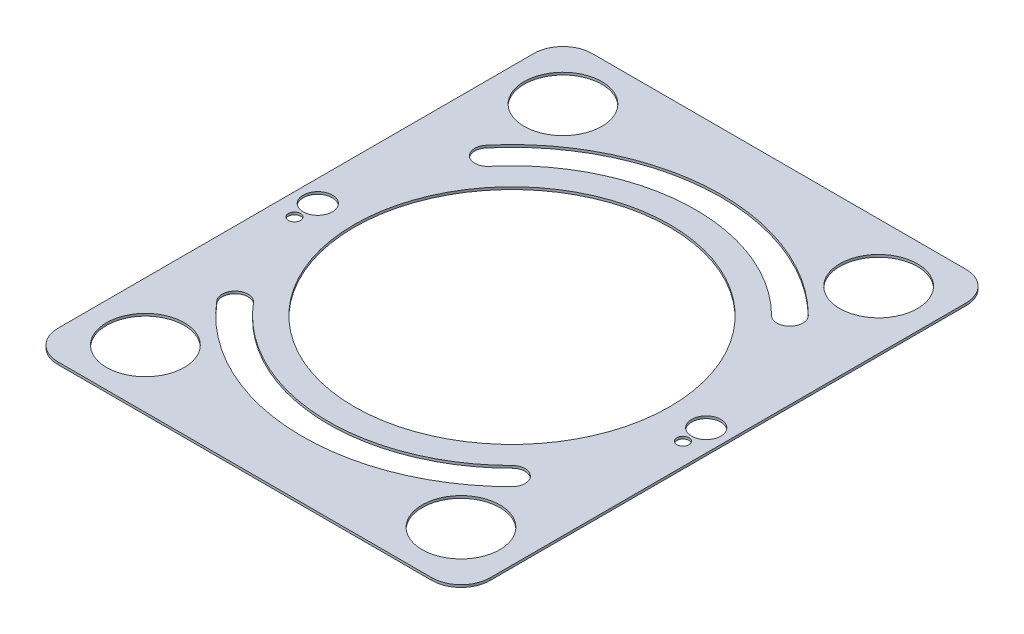
ISO-10303-21;
HEADER;
FILE_DESCRIPTION(('STEP AP214'),'2;1');
FILE_NAME('part.step','',(''),(''),'','','');
FILE_SCHEMA(('AUTOMOTIVE_DESIGN { 1 0 10303 214 1 1 1 1 }'));
ENDSEC;
DATA;
#1=APPLICATION_CONTEXT('core data for automotive mechanical design processes');
#2=APPLICATION_PROTOCOL_DEFINITION('international standard','automotive_design',2000,#1);
#3=PRODUCT_CONTEXT('',#1,'mechanical');
#4=PRODUCT('Part','Part','',(#3));
#5=PRODUCT_RELATED_PRODUCT_CATEGORY('part','',(#4));
#6=PRODUCT_DEFINITION_FORMATION('','',#4);
#7=PRODUCT_DEFINITION_CONTEXT('part definition',#1,'design');
#8=PRODUCT_DEFINITION('design','',#6,#7);
#9=PRODUCT_DEFINITION_SHAPE('','',#8);
#10=(LENGTH_UNIT() NAMED_UNIT(*) SI_UNIT(.MILLI.,.METRE.));
#11=(NAMED_UNIT(*) PLANE_ANGLE_UNIT() SI_UNIT($,.RADIAN.));
#12=(NAMED_UNIT(*) SI_UNIT($,.STERADIAN.) SOLID_ANGLE_UNIT());
#13=UNCERTAINTY_MEASURE_WITH_UNIT(LENGTH_MEASURE(1.E-05),#10,'distance_accuracy_value','');
#14=(GEOMETRIC_REPRESENTATION_CONTEXT(3) GLOBAL_UNCERTAINTY_ASSIGNED_CONTEXT((#13)) GLOBAL_UNIT_ASSIGNED_CONTEXT((#10,
#11,#12)) REPRESENTATION_CONTEXT('',''));
#15=CARTESIAN_POINT('',(0.,0.,0.));
#16=DIRECTION('',(0.,0.,1.));
#17=DIRECTION('',(1.,0.,0.));
#18=AXIS2_PLACEMENT_3D('',#15,#16,#17);
#19=CARTESIAN_POINT('',(-61.1187499999998,0.793750000000093,77.7875));
#20=DIRECTION('',(0.,1.,0.));
#21=DIRECTION('',(0.,0.,1.));
#22=AXIS2_PLACEMENT_3D('',#19,#20,#21);
#23=PLANE('',#22);
#24=CARTESIAN_POINT('',(-63.4999999999999,0.793749999999982,7.6199999999993));
#25=DIRECTION('',(0.,1.,0.));
#26=DIRECTION('',(0.,0.,1.));
#27=AXIS2_PLACEMENT_3D('',#24,#25,#26);
#28=CIRCLE('',#27,1.984375);
#29=CARTESIAN_POINT('',(-63.4999999999999,0.793749999999982,9.6043749999993));
#30=VERTEX_POINT('',#29);
#31=EDGE_CURVE('E401',#30,#30,#28,.T.);
#32=ORIENTED_EDGE('',*,*,#31,.F.);
#33=EDGE_LOOP('',(#32));
#34=FACE_BOUND('',#33,.T.);
#35=CARTESIAN_POINT('',(-63.4999999999999,0.793749999999982,0.));
#36=DIRECTION('',(0.,1.,0.));
#37=DIRECTION('',(0.,0.,1.));
#38=AXIS2_PLACEMENT_3D('',#35,#36,#37);
#39=CIRCLE('',#38,4.7625);
#40=CARTESIAN_POINT('',(-63.4999999999999,0.793749999999982,4.7625));
#41=VERTEX_POINT('',#40);
#42=EDGE_CURVE('E409',#41,#41,#39,.T.);
#43=ORIENTED_EDGE('',*,*,#42,.F.);
#44=EDGE_LOOP('',(#43));
#45=FACE_BOUND('',#44,.T.);
#46=CARTESIAN_POINT('',(0.,0.793749999999982,0.));
#47=DIRECTION('',(0.,-1.,0.));
#48=DIRECTION('',(0.,0.,-1.));
#49=AXIS2_PLACEMENT_3D('',#46,#47,#48);
#50=CIRCLE('',#49,60.0000324);
#51=CARTESIAN_POINT('',(42.426429781453,0.793749999999815,42.4264297814525));
#52=VERTEX_POINT('',#51);
#53=CARTESIAN_POINT('',(-45.9626914069787,0.793749999999871,38.5672774075102));
#54=VERTEX_POINT('',#53);
#55=EDGE_CURVE('E153',#52,#54,#50,.T.);
#56=ORIENTED_EDGE('',*,*,#55,.F.);
#57=CARTESIAN_POINT('',(45.4316352243083,0.793749999998761,45.4316352243054));
#58=DIRECTION('',(0.,1.,0.));
#59=DIRECTION('',(0.,0.,-1.));
#60=AXIS2_PLACEMENT_3D('',#57,#58,#59);
#61=CIRCLE('',#60,4.25000229499999);
#62=CARTESIAN_POINT('',(48.4368406671589,0.793749999999593,48.4368406671583));
#63=VERTEX_POINT('',#62);
#64=EDGE_CURVE('E145',#63,#52,#61,.T.);
#65=ORIENTED_EDGE('',*,*,#64,.F.);
#66=CARTESIAN_POINT('',(0.,0.793749999999982,0.));
#67=DIRECTION('',(0.,1.,0.));
#68=DIRECTION('',(0.,0.,-1.));
#69=AXIS2_PLACEMENT_3D('',#66,#67,#68);
#70=CIRCLE('',#69,68.50003699);
#71=CARTESIAN_POINT('',(-52.474072689634,0.793749999999982,44.0309750402409));
#72=VERTEX_POINT('',#71);
#73=EDGE_CURVE('E168',#72,#63,#70,.T.);
#74=ORIENTED_EDGE('',*,*,#73,.F.);
#75=CARTESIAN_POINT('',(-49.2183820483064,0.793749999999871,41.2991262238755));
#76=DIRECTION('',(0.,1.,0.));
#77=DIRECTION('',(0.,0.,-1.));
#78=AXIS2_PLACEMENT_3D('',#75,#76,#77);
#79=CIRCLE('',#78,4.25000229499998);
#80=EDGE_CURVE('E166',#54,#72,#79,.T.);
#81=ORIENTED_EDGE('',*,*,#80,.F.);
#82=EDGE_LOOP('',(#56,#65,#74,#81));
#83=FACE_BOUND('',#82,.T.);
#84=CARTESIAN_POINT('',(45.4316352243062,0.793749999999482,-45.4316352243054));
#85=DIRECTION('',(0.,1.,0.));
#86=DIRECTION('',(0.,0.,1.));
#87=AXIS2_PLACEMENT_3D('',#84,#85,#86);
#88=CIRCLE('',#87,4.25000229499999);
#89=CARTESIAN_POINT('',(42.4264297814529,0.793749999999871,-42.4264297814525));
#90=VERTEX_POINT('',#89);
#91=CARTESIAN_POINT('',(48.4368406671586,0.79374999999976,-48.4368406671582));
#92=VERTEX_POINT('',#91);
#93=EDGE_CURVE('E186',#90,#92,#88,.T.);
#94=ORIENTED_EDGE('',*,*,#93,.F.);
#95=CARTESIAN_POINT('',(0.,0.793749999999982,0.));
#96=DIRECTION('',(0.,-1.,0.));
#97=DIRECTION('',(0.,0.,1.));
#98=AXIS2_PLACEMENT_3D('',#95,#96,#97);
#99=CIRCLE('',#98,60.0000324);
#100=CARTESIAN_POINT('',(-45.9626914069787,0.793749999999982,-38.5672774075108));
#101=VERTEX_POINT('',#100);
#102=EDGE_CURVE('E184',#101,#90,#99,.T.);
#103=ORIENTED_EDGE('',*,*,#102,.F.);
#104=CARTESIAN_POINT('',(-49.2183820483064,0.793749999999871,-41.2991262238762));
#105=DIRECTION('',(0.,1.,0.));
#106=DIRECTION('',(0.,0.,1.));
#107=AXIS2_PLACEMENT_3D('',#104,#105,#106);
#108=CIRCLE('',#107,4.25000229499998);
#109=CARTESIAN_POINT('',(-52.474072689632,0.793750000000593,-44.0309750402415));
#110=VERTEX_POINT('',#109);
#111=EDGE_CURVE('E192',#110,#101,#108,.T.);
#112=ORIENTED_EDGE('',*,*,#111,.F.);
#113=CARTESIAN_POINT('',(0.,0.793749999999982,0.));
#114=DIRECTION('',(0.,1.,0.));
#115=DIRECTION('',(0.,0.,1.));
#116=AXIS2_PLACEMENT_3D('',#113,#114,#115);
#117=CIRCLE('',#116,68.50003699);
#118=EDGE_CURVE('E189',#92,#110,#117,.T.);
#119=ORIENTED_EDGE('',*,*,#118,.F.);
#120=EDGE_LOOP('',(#94,#103,#112,#119));
#121=FACE_BOUND('',#120,.T.);
#122=CARTESIAN_POINT('',(51.5937500000005,0.793749999999982,68.2625));
#123=DIRECTION('',(0.,1.,0.));
#124=DIRECTION('',(0.,0.,1.));
#125=AXIS2_PLACEMENT_3D('',#122,#123,#124);
#126=CIRCLE('',#125,12.7);
#127=CARTESIAN_POINT('',(51.5937500000005,0.793749999999982,80.9625));
#128=VERTEX_POINT('',#127);
#129=EDGE_CURVE('E215',#128,#128,#126,.T.);
#130=ORIENTED_EDGE('',*,*,#129,.F.);
#131=EDGE_LOOP('',(#130));
#132=FACE_BOUND('',#131,.T.);
#133=CARTESIAN_POINT('',(51.5937500000002,0.793749999999427,-68.2625000000001));
#134=DIRECTION('',(0.,1.,0.));
#135=DIRECTION('',(0.,0.,1.));
#136=AXIS2_PLACEMENT_3D('',#133,#134,#135);
#137=CIRCLE('',#136,12.7);
#138=CARTESIAN_POINT('',(51.5937500000002,0.793749999999427,-55.5625000000001));
#139=VERTEX_POINT('',#138);
#140=EDGE_CURVE('E227',#139,#139,#137,.T.);
#141=ORIENTED_EDGE('',*,*,#140,.F.);
#142=EDGE_LOOP('',(#141));
#143=FACE_BOUND('',#142,.T.);
#144=CARTESIAN_POINT('',(-61.1187499999998,0.793750000000093,77.7875));
#145=DIRECTION('',(0.,1.,0.));
#146=DIRECTION('',(0.,0.,1.));
#147=AXIS2_PLACEMENT_3D('',#144,#145,#146);
#148=CIRCLE('',#147,9.525);
#149=CARTESIAN_POINT('',(-70.6437499999999,0.793750000000037,77.7875));
#150=VERTEX_POINT('',#149);
#151=CARTESIAN_POINT('',(-61.1187499999982,0.793750000000759,87.3125));
#152=VERTEX_POINT('',#151);
#153=EDGE_CURVE('E239',#150,#152,#148,.T.);
#154=ORIENTED_EDGE('',*,*,#153,.T.);
#155=DIRECTION('',(1.,0.,0.));
#156=VECTOR('',#155,1.);
#157=CARTESIAN_POINT('',(-61.1187499999982,0.793750000000759,87.3125));
#158=LINE('',#157,#156);
#159=CARTESIAN_POINT('',(61.1187500000006,0.793749999999427,87.3125));
#160=VERTEX_POINT('',#159);
#161=EDGE_CURVE('E242',#152,#160,#158,.T.);
#162=ORIENTED_EDGE('',*,*,#161,.T.);
#163=CARTESIAN_POINT('',(61.1187500000006,0.793749999999427,77.7875));
#164=DIRECTION('',(0.,1.,0.));
#165=DIRECTION('',(0.,0.,1.));
#166=AXIS2_PLACEMENT_3D('',#163,#164,#165);
#167=CIRCLE('',#166,9.525);
#168=CARTESIAN_POINT('',(70.6437500000024,0.793749999998872,77.7875));
#169=VERTEX_POINT('',#168);
#170=EDGE_CURVE('E245',#160,#169,#167,.T.);
#171=ORIENTED_EDGE('',*,*,#170,.T.);
#172=DIRECTION('',(0.,0.,-1.));
#173=VECTOR('',#172,1.);
#174=CARTESIAN_POINT('',(70.6437500000001,0.793749999999815,-77.7875));
#175=LINE('',#174,#173);
#176=CARTESIAN_POINT('',(70.6437500000001,0.793749999999815,-77.7875));
#177=VERTEX_POINT('',#176);
#178=EDGE_CURVE('E247',#169,#177,#175,.T.);
#179=ORIENTED_EDGE('',*,*,#178,.T.);
#180=CARTESIAN_POINT('',(61.1187500000001,0.793749999999649,-77.7875000000001));
#181=DIRECTION('',(0.,1.,0.));
#182=DIRECTION('',(0.,0.,-1.));
#183=AXIS2_PLACEMENT_3D('',#180,#181,#182);
#184=CIRCLE('',#183,9.525);
#185=CARTESIAN_POINT('',(61.1187500000001,0.793749999999649,-87.3125000000001));
#186=VERTEX_POINT('',#185);
#187=EDGE_CURVE('E249',#177,#186,#184,.T.);
#188=ORIENTED_EDGE('',*,*,#187,.T.);
#189=DIRECTION('',(-1.,0.,0.));
#190=VECTOR('',#189,1.);
#191=CARTESIAN_POINT('',(-61.1187499999996,0.793749999999427,-87.3125000000001));
#192=LINE('',#191,#190);
#193=CARTESIAN_POINT('',(-61.1187499999996,0.793749999999427,-87.3125000000001));
#194=VERTEX_POINT('',#193);
#195=EDGE_CURVE('E251',#186,#194,#192,.T.);
#196=ORIENTED_EDGE('',*,*,#195,.T.);
#197=CARTESIAN_POINT('',(-61.1187499999999,0.793749999999871,-77.7875000000001));
#198=DIRECTION('',(0.,1.,0.));
#199=DIRECTION('',(0.,0.,1.));
#200=AXIS2_PLACEMENT_3D('',#197,#198,#199);
#201=CIRCLE('',#200,9.525);
#202=CARTESIAN_POINT('',(-70.6437499999999,0.793749999999205,-77.7875));
#203=VERTEX_POINT('',#202);
#204=EDGE_CURVE('E253',#194,#203,#201,.T.);
#205=ORIENTED_EDGE('',*,*,#204,.T.);
#206=DIRECTION('',(0.,0.,1.));
#207=VECTOR('',#206,1.);
#208=CARTESIAN_POINT('',(-70.6437499999999,0.793749999999205,-77.7875));
#209=LINE('',#208,#207);
#210=EDGE_CURVE('E255',#203,#150,#209,.T.);
#211=ORIENTED_EDGE('',*,*,#210,.T.);
#212=EDGE_LOOP('',(#154,#162,#171,#179,#188,#196,#205,#211));
#213=FACE_BOUND('',#212,.T.);
#214=CARTESIAN_POINT('',(-51.5937499999996,0.793749999999982,-68.2625000000001));
#215=DIRECTION('',(0.,1.,0.));
#216=DIRECTION('',(0.,0.,1.));
#217=AXIS2_PLACEMENT_3D('',#214,#215,#216);
#218=CIRCLE('',#217,12.7);
#219=CARTESIAN_POINT('',(-51.5937499999996,0.793749999999982,-55.5625000000001));
#220=VERTEX_POINT('',#219);
#221=EDGE_CURVE('E233',#220,#220,#218,.T.);
#222=ORIENTED_EDGE('',*,*,#221,.F.);
#223=EDGE_LOOP('',(#222));
#224=FACE_BOUND('',#223,.T.);
#225=CARTESIAN_POINT('',(-51.59375,0.793749999999982,68.2625));
#226=DIRECTION('',(0.,1.,0.));
#227=DIRECTION('',(0.,0.,1.));
#228=AXIS2_PLACEMENT_3D('',#225,#226,#227);
#229=CIRCLE('',#228,12.7);
#230=CARTESIAN_POINT('',(-51.59375,0.793749999999982,80.9625));
#231=VERTEX_POINT('',#230);
#232=EDGE_CURVE('E221',#231,#231,#229,.T.);
#233=ORIENTED_EDGE('',*,*,#232,.F.);
#234=EDGE_LOOP('',(#233));
#235=FACE_BOUND('',#234,.T.);
#236=CARTESIAN_POINT('',(0.,0.793749999999982,0.));
#237=DIRECTION('',(0.,1.,0.));
#238=DIRECTION('',(0.,0.,1.));
#239=AXIS2_PLACEMENT_3D('',#236,#237,#238);
#240=CIRCLE('',#239,51.59375);
#241=CARTESIAN_POINT('',(0.,0.793749999999982,51.59375));
#242=VERTEX_POINT('',#241);
#243=EDGE_CURVE('E174',#242,#242,#240,.T.);
#244=ORIENTED_EDGE('',*,*,#243,.F.);
#245=EDGE_LOOP('',(#244));
#246=FACE_BOUND('',#245,.T.);
#247=CARTESIAN_POINT('',(63.5000000000012,0.793749999999427,0.));
#248=DIRECTION('',(0.,1.,0.));
#249=DIRECTION('',(0.,0.,1.));
#250=AXIS2_PLACEMENT_3D('',#247,#248,#249);
#251=CIRCLE('',#250,4.7625);
#252=CARTESIAN_POINT('',(63.5000000000012,0.793749999999427,4.7625));
#253=VERTEX_POINT('',#252);
#254=EDGE_CURVE('E405',#253,#253,#251,.T.);
#255=ORIENTED_EDGE('',*,*,#254,.F.);
#256=EDGE_LOOP('',(#255));
#257=FACE_BOUND('',#256,.T.);
#258=CARTESIAN_POINT('',(63.5000000000012,0.793749999999427,7.6199999999993));
#259=DIRECTION('',(0.,1.,0.));
#260=DIRECTION('',(0.,0.,1.));
#261=AXIS2_PLACEMENT_3D('',#258,#259,#260);
#262=CIRCLE('',#261,1.984375);
#263=CARTESIAN_POINT('',(63.5000000000012,0.793749999999427,9.6043749999993));
#264=VERTEX_POINT('',#263);
#265=EDGE_CURVE('E396',#264,#264,#262,.T.);
#266=ORIENTED_EDGE('',*,*,#265,.F.);
#267=EDGE_LOOP('',(#266));
#268=FACE_BOUND('',#267,.T.);
#269=ADVANCED_FACE('F32',(#34,#45,#83,#121,#132,#143,#213,#224,#235,#246,#257,#268),#23,.T.);
#270=CARTESIAN_POINT('',(-61.11875,0.,77.7875));
#271=DIRECTION('',(0.,1.,0.));
#272=DIRECTION('',(0.,0.,1.));
#273=AXIS2_PLACEMENT_3D('',#270,#271,#272);
#274=PLANE('',#273);
#275=CARTESIAN_POINT('',(0.,0.,0.));
#276=DIRECTION('',(0.,-1.,0.));
#277=DIRECTION('',(0.,0.,1.));
#278=AXIS2_PLACEMENT_3D('',#275,#276,#277);
#279=CIRCLE('',#278,60.0000324);
#280=CARTESIAN_POINT('',(-45.9626914069785,-2.77555756156289E-13,-38.5672774075108));
#281=VERTEX_POINT('',#280);
#282=CARTESIAN_POINT('',(42.4264297814531,-2.22044604925031E-13,-42.4264297814525));
#283=VERTEX_POINT('',#282);
#284=EDGE_CURVE('E161',#281,#283,#279,.T.);
#285=ORIENTED_EDGE('',*,*,#284,.T.);
#286=CARTESIAN_POINT('',(45.4316352243065,-1.33226762955019E-12,-45.4316352243054));
#287=DIRECTION('',(0.,1.,0.));
#288=DIRECTION('',(0.,0.,1.));
#289=AXIS2_PLACEMENT_3D('',#286,#287,#288);
#290=CIRCLE('',#289,4.25000229499999);
#291=CARTESIAN_POINT('',(48.436840667159,-4.44089209850063E-13,-48.4368406671582));
#292=VERTEX_POINT('',#291);
#293=EDGE_CURVE('E197',#283,#292,#290,.T.);
#294=ORIENTED_EDGE('',*,*,#293,.T.);
#295=CARTESIAN_POINT('',(0.,0.,0.));
#296=DIRECTION('',(0.,1.,0.));
#297=DIRECTION('',(0.,0.,1.));
#298=AXIS2_PLACEMENT_3D('',#295,#296,#297);
#299=CIRCLE('',#298,68.50003699);
#300=CARTESIAN_POINT('',(-52.4740726896339,-2.77555756156289E-13,-44.0309750402415));
#301=VERTEX_POINT('',#300);
#302=EDGE_CURVE('E200',#292,#301,#299,.T.);
#303=ORIENTED_EDGE('',*,*,#302,.T.);
#304=CARTESIAN_POINT('',(-49.2183820483045,-1.66533453693773E-13,-41.2991262238762));
#305=DIRECTION('',(0.,1.,0.));
#306=DIRECTION('',(0.,0.,1.));
#307=AXIS2_PLACEMENT_3D('',#304,#305,#306);
#308=CIRCLE('',#307,4.25000229499998);
#309=EDGE_CURVE('E187',#301,#281,#308,.T.);
#310=ORIENTED_EDGE('',*,*,#309,.T.);
#311=EDGE_LOOP('',(#285,#294,#303,#310));
#312=FACE_BOUND('',#311,.T.);
#313=CARTESIAN_POINT('',(-61.11875,0.,77.7875));
#314=DIRECTION('',(0.,1.,0.));
#315=DIRECTION('',(0.,0.,1.));
#316=AXIS2_PLACEMENT_3D('',#313,#314,#315);
#317=CIRCLE('',#316,9.525);
#318=CARTESIAN_POINT('',(-70.64375,0.,77.7875));
#319=VERTEX_POINT('',#318);
#320=CARTESIAN_POINT('',(-61.1187499999998,1.11022302462516E-13,87.3125));
#321=VERTEX_POINT('',#320);
#322=EDGE_CURVE('E236',#319,#321,#317,.T.);
#323=ORIENTED_EDGE('',*,*,#322,.F.);
#324=DIRECTION('',(0.,0.,1.));
#325=VECTOR('',#324,1.);
#326=CARTESIAN_POINT('',(-70.6437499999999,-7.21644966006352E-13,-77.7875));
#327=LINE('',#326,#325);
#328=CARTESIAN_POINT('',(-70.6437499999999,-7.21644966006352E-13,-77.7875));
#329=VERTEX_POINT('',#328);
#330=EDGE_CURVE('E243',#329,#319,#327,.T.);
#331=ORIENTED_EDGE('',*,*,#330,.F.);
#332=CARTESIAN_POINT('',(-61.1187499999996,-6.66133814775094E-13,-77.7875000000001));
#333=DIRECTION('',(0.,1.,0.));
#334=DIRECTION('',(0.,0.,1.));
#335=AXIS2_PLACEMENT_3D('',#332,#333,#334);
#336=CIRCLE('',#335,9.525);
#337=CARTESIAN_POINT('',(-61.1187499999998,-1.66533453693773E-13,-87.3125000000001));
#338=VERTEX_POINT('',#337);
#339=EDGE_CURVE('E270',#338,#329,#336,.T.);
#340=ORIENTED_EDGE('',*,*,#339,.F.);
#341=DIRECTION('',(-1.,0.,0.));
#342=VECTOR('',#341,1.);
#343=CARTESIAN_POINT('',(-61.1187499999998,-1.66533453693773E-13,-87.3125000000001));
#344=LINE('',#343,#342);
#345=CARTESIAN_POINT('',(61.11875,-3.33066907387547E-13,-87.3125000000001));
#346=VERTEX_POINT('',#345);
#347=EDGE_CURVE('E268',#346,#338,#344,.T.);
#348=ORIENTED_EDGE('',*,*,#347,.F.);
#349=CARTESIAN_POINT('',(61.1187500000022,-2.44249065417534E-12,-77.7875000000001));
#350=DIRECTION('',(0.,1.,0.));
#351=DIRECTION('',(0.,0.,-1.));
#352=AXIS2_PLACEMENT_3D('',#349,#350,#351);
#353=CIRCLE('',#352,9.525);
#354=CARTESIAN_POINT('',(70.6437500000005,-3.33066907387547E-13,-77.7875));
#355=VERTEX_POINT('',#354);
#356=EDGE_CURVE('E266',#355,#346,#353,.T.);
#357=ORIENTED_EDGE('',*,*,#356,.F.);
#358=DIRECTION('',(0.,0.,-1.));
#359=VECTOR('',#358,1.);
#360=CARTESIAN_POINT('',(70.6437500000005,-3.33066907387547E-13,-77.7875));
#361=LINE('',#360,#359);
#362=CARTESIAN_POINT('',(70.6437500000033,-1.49880108324396E-12,77.7875));
#363=VERTEX_POINT('',#362);
#364=EDGE_CURVE('E264',#363,#355,#361,.T.);
#365=ORIENTED_EDGE('',*,*,#364,.F.);
#366=CARTESIAN_POINT('',(61.1187500000028,-1.49880108324396E-12,77.7875));
#367=DIRECTION('',(0.,1.,0.));
#368=DIRECTION('',(0.,0.,1.));
#369=AXIS2_PLACEMENT_3D('',#366,#367,#368);
#370=CIRCLE('',#369,9.525);
#371=CARTESIAN_POINT('',(61.1187500000028,-1.49880108324396E-12,87.3125));
#372=VERTEX_POINT('',#371);
#373=EDGE_CURVE('E262',#372,#363,#370,.T.);
#374=ORIENTED_EDGE('',*,*,#373,.F.);
#375=DIRECTION('',(1.,0.,0.));
#376=VECTOR('',#375,1.);
#377=CARTESIAN_POINT('',(-61.1187499999998,1.11022302462516E-13,87.3125));
#378=LINE('',#377,#376);
#379=EDGE_CURVE('E260',#321,#372,#378,.T.);
#380=ORIENTED_EDGE('',*,*,#379,.F.);
#381=EDGE_LOOP('',(#323,#331,#340,#348,#357,#365,#374,#380));
#382=FACE_BOUND('',#381,.T.);
#383=CARTESIAN_POINT('',(-51.5937499999992,-8.32667268468867E-13,-68.2625000000001));
#384=DIRECTION('',(0.,1.,0.));
#385=DIRECTION('',(0.,0.,1.));
#386=AXIS2_PLACEMENT_3D('',#383,#384,#385);
#387=CIRCLE('',#386,12.7);
#388=CARTESIAN_POINT('',(-51.5937499999992,-8.32667268468867E-13,-55.5625000000001));
#389=VERTEX_POINT('',#388);
#390=EDGE_CURVE('E230',#389,#389,#387,.T.);
#391=ORIENTED_EDGE('',*,*,#390,.T.);
#392=EDGE_LOOP('',(#391));
#393=FACE_BOUND('',#392,.T.);
#394=CARTESIAN_POINT('',(51.5937500000025,-1.55431223447522E-12,-68.2625000000001));
#395=DIRECTION('',(0.,1.,0.));
#396=DIRECTION('',(0.,0.,1.));
#397=AXIS2_PLACEMENT_3D('',#394,#395,#396);
#398=CIRCLE('',#397,12.7);
#399=CARTESIAN_POINT('',(51.5937500000025,-1.55431223447522E-12,-55.5625000000001));
#400=VERTEX_POINT('',#399);
#401=EDGE_CURVE('E224',#400,#400,#398,.T.);
#402=ORIENTED_EDGE('',*,*,#401,.T.);
#403=EDGE_LOOP('',(#402));
#404=FACE_BOUND('',#403,.T.);
#405=CARTESIAN_POINT('',(-51.5937499999999,-1.66533453693773E-13,68.2625));
#406=DIRECTION('',(0.,1.,0.));
#407=DIRECTION('',(0.,0.,1.));
#408=AXIS2_PLACEMENT_3D('',#405,#406,#407);
#409=CIRCLE('',#408,12.7);
#410=CARTESIAN_POINT('',(-51.5937499999999,-1.66533453693773E-13,80.9625));
#411=VERTEX_POINT('',#410);
#412=EDGE_CURVE('E218',#411,#411,#409,.T.);
#413=ORIENTED_EDGE('',*,*,#412,.T.);
#414=EDGE_LOOP('',(#413));
#415=FACE_BOUND('',#414,.T.);
#416=CARTESIAN_POINT('',(51.5937500000004,-1.66533453693773E-13,68.2625));
#417=DIRECTION('',(0.,1.,0.));
#418=DIRECTION('',(0.,0.,1.));
#419=AXIS2_PLACEMENT_3D('',#416,#417,#418);
#420=CIRCLE('',#419,12.7);
#421=CARTESIAN_POINT('',(51.5937500000004,-1.66533453693773E-13,80.9625));
#422=VERTEX_POINT('',#421);
#423=EDGE_CURVE('E214',#422,#422,#420,.T.);
#424=ORIENTED_EDGE('',*,*,#423,.T.);
#425=EDGE_LOOP('',(#424));
#426=FACE_BOUND('',#425,.T.);
#427=CARTESIAN_POINT('',(45.4316352243082,-1.27675647831893E-12,45.4316352243054));
#428=DIRECTION('',(0.,1.,0.));
#429=DIRECTION('',(0.,0.,-1.));
#430=AXIS2_PLACEMENT_3D('',#427,#428,#429);
#431=CIRCLE('',#430,4.25000229499999);
#432=CARTESIAN_POINT('',(48.4368406671609,-1.22124532708767E-12,48.4368406671583));
#433=VERTEX_POINT('',#432);
#434=CARTESIAN_POINT('',(42.4264297814531,-2.22044604925031E-13,42.4264297814525));
#435=VERTEX_POINT('',#434);
#436=EDGE_CURVE('E55',#433,#435,#431,.T.);
#437=ORIENTED_EDGE('',*,*,#436,.T.);
#438=CARTESIAN_POINT('',(0.,0.,0.));
#439=DIRECTION('',(0.,-1.,0.));
#440=DIRECTION('',(0.,0.,-1.));
#441=AXIS2_PLACEMENT_3D('',#438,#439,#440);
#442=CIRCLE('',#441,60.0000324);
#443=CARTESIAN_POINT('',(-45.9626914069786,-2.77555756156289E-13,38.5672774075102));
#444=VERTEX_POINT('',#443);
#445=EDGE_CURVE('E160',#435,#444,#442,.T.);
#446=ORIENTED_EDGE('',*,*,#445,.T.);
#447=CARTESIAN_POINT('',(-49.2183820483062,1.66533453693773E-13,41.2991262238755));
#448=DIRECTION('',(0.,1.,0.));
#449=DIRECTION('',(0.,0.,-1.));
#450=AXIS2_PLACEMENT_3D('',#447,#448,#449);
#451=CIRCLE('',#450,4.25000229499998);
#452=CARTESIAN_POINT('',(-52.474072689634,0.,44.0309750402408));
#453=VERTEX_POINT('',#452);
#454=EDGE_CURVE('E176',#444,#453,#451,.T.);
#455=ORIENTED_EDGE('',*,*,#454,.T.);
#456=CARTESIAN_POINT('',(0.,0.,0.));
#457=DIRECTION('',(0.,1.,0.));
#458=DIRECTION('',(0.,0.,-1.));
#459=AXIS2_PLACEMENT_3D('',#456,#457,#458);
#460=CIRCLE('',#459,68.50003699);
#461=EDGE_CURVE('E154',#453,#433,#460,.T.);
#462=ORIENTED_EDGE('',*,*,#461,.T.);
#463=EDGE_LOOP('',(#437,#446,#455,#462));
#464=FACE_BOUND('',#463,.T.);
#465=CARTESIAN_POINT('',(0.,0.,0.));
#466=DIRECTION('',(0.,1.,0.));
#467=DIRECTION('',(0.,0.,1.));
#468=AXIS2_PLACEMENT_3D('',#465,#466,#467);
#469=CIRCLE('',#468,51.59375);
#470=CARTESIAN_POINT('',(0.,0.,51.59375));
#471=VERTEX_POINT('',#470);
#472=EDGE_CURVE('E379',#471,#471,#469,.T.);
#473=ORIENTED_EDGE('',*,*,#472,.T.);
#474=EDGE_LOOP('',(#473));
#475=FACE_BOUND('',#474,.T.);
#476=CARTESIAN_POINT('',(-63.5,0.,0.));
#477=DIRECTION('',(0.,1.,0.));
#478=DIRECTION('',(0.,0.,1.));
#479=AXIS2_PLACEMENT_3D('',#476,#477,#478);
#480=CIRCLE('',#479,4.7625);
#481=CARTESIAN_POINT('',(-63.5,0.,4.7625));
#482=VERTEX_POINT('',#481);
#483=EDGE_CURVE('E383',#482,#482,#480,.T.);
#484=ORIENTED_EDGE('',*,*,#483,.T.);
#485=EDGE_LOOP('',(#484));
#486=FACE_BOUND('',#485,.T.);
#487=CARTESIAN_POINT('',(63.5000000000002,-1.66533453693773E-13,0.));
#488=DIRECTION('',(0.,1.,0.));
#489=DIRECTION('',(0.,0.,1.));
#490=AXIS2_PLACEMENT_3D('',#487,#488,#489);
#491=CIRCLE('',#490,4.7625);
#492=CARTESIAN_POINT('',(63.5000000000002,-1.66533453693773E-13,4.7625));
#493=VERTEX_POINT('',#492);
#494=EDGE_CURVE('E387',#493,#493,#491,.T.);
#495=ORIENTED_EDGE('',*,*,#494,.T.);
#496=EDGE_LOOP('',(#495));
#497=FACE_BOUND('',#496,.T.);
#498=CARTESIAN_POINT('',(-63.5,0.,7.6199999999993));
#499=DIRECTION('',(0.,1.,0.));
#500=DIRECTION('',(0.,0.,1.));
#501=AXIS2_PLACEMENT_3D('',#498,#499,#500);
#502=CIRCLE('',#501,1.984375);
#503=CARTESIAN_POINT('',(-63.5,0.,9.6043749999993));
#504=VERTEX_POINT('',#503);
#505=EDGE_CURVE('E391',#504,#504,#502,.T.);
#506=ORIENTED_EDGE('',*,*,#505,.T.);
#507=EDGE_LOOP('',(#506));
#508=FACE_BOUND('',#507,.T.);
#509=CARTESIAN_POINT('',(63.5000000000002,-1.66533453693773E-13,7.6199999999993));
#510=DIRECTION('',(0.,1.,0.));
#511=DIRECTION('',(0.,0.,1.));
#512=AXIS2_PLACEMENT_3D('',#509,#510,#511);
#513=CIRCLE('',#512,1.984375);
#514=CARTESIAN_POINT('',(63.5000000000002,-1.66533453693773E-13,9.6043749999993));
#515=VERTEX_POINT('',#514);
#516=EDGE_CURVE('E394',#515,#515,#513,.T.);
#517=ORIENTED_EDGE('',*,*,#516,.T.);
#518=EDGE_LOOP('',(#517));
#519=FACE_BOUND('',#518,.T.);
#520=ADVANCED_FACE('F300',(#312,#382,#393,#404,#415,#426,#464,#475,#486,#497,#508,#519),#274,.F.);
#521=CARTESIAN_POINT('',(-61.1187499999998,0.793750000000093,77.7875));
#522=DIRECTION('',(0.,-1.,0.));
#523=DIRECTION('',(0.,0.,-1.));
#524=AXIS2_PLACEMENT_3D('',#521,#522,#523);
#525=CYLINDRICAL_SURFACE('',#524,9.525);
#526=ORIENTED_EDGE('',*,*,#322,.T.);
#527=DIRECTION('',(0.,-1.,0.));
#528=VECTOR('',#527,1.);
#529=CARTESIAN_POINT('',(-61.1187499999982,0.793750000000759,87.3125));
#530=LINE('',#529,#528);
#531=EDGE_CURVE('E11',#152,#321,#530,.T.);
#532=ORIENTED_EDGE('',*,*,#531,.F.);
#533=ORIENTED_EDGE('',*,*,#153,.F.);
#534=DIRECTION('',(0.,-1.,0.));
#535=VECTOR('',#534,1.);
#536=CARTESIAN_POINT('',(-70.6437499999999,0.793750000000037,77.7875));
#537=LINE('',#536,#535);
#538=EDGE_CURVE('E257',#150,#319,#537,.T.);
#539=ORIENTED_EDGE('',*,*,#538,.T.);
#540=EDGE_LOOP('',(#526,#532,#533,#539));
#541=FACE_BOUND('',#540,.T.);
#542=ADVANCED_FACE('F34',(#541),#525,.T.);
#543=CARTESIAN_POINT('',(-61.1187499999982,0.793750000000759,87.3125));
#544=DIRECTION('',(0.,0.,-1.));
#545=DIRECTION('',(-1.,0.,0.));
#546=AXIS2_PLACEMENT_3D('',#543,#544,#545);
#547=PLANE('',#546);
#548=ORIENTED_EDGE('',*,*,#379,.T.);
#549=DIRECTION('',(0.,-1.,0.));
#550=VECTOR('',#549,1.);
#551=CARTESIAN_POINT('',(61.1187500000006,0.793749999999427,87.3125));
#552=LINE('',#551,#550);
#553=EDGE_CURVE('E40',#160,#372,#552,.T.);
#554=ORIENTED_EDGE('',*,*,#553,.F.);
#555=ORIENTED_EDGE('',*,*,#161,.F.);
#556=ORIENTED_EDGE('',*,*,#531,.T.);
#557=EDGE_LOOP('',(#548,#554,#555,#556));
#558=FACE_BOUND('',#557,.T.);
#559=ADVANCED_FACE('F318',(#558),#547,.F.);
#560=CARTESIAN_POINT('',(61.1187500000006,0.793749999999427,77.7875));
#561=DIRECTION('',(0.,-1.,0.));
#562=DIRECTION('',(0.,0.,-1.));
#563=AXIS2_PLACEMENT_3D('',#560,#561,#562);
#564=CYLINDRICAL_SURFACE('',#563,9.525);
#565=ORIENTED_EDGE('',*,*,#373,.T.);
#566=DIRECTION('',(0.,-1.,0.));
#567=VECTOR('',#566,1.);
#568=CARTESIAN_POINT('',(70.6437500000024,0.793749999998872,77.7875));
#569=LINE('',#568,#567);
#570=EDGE_CURVE('E287',#169,#363,#569,.T.);
#571=ORIENTED_EDGE('',*,*,#570,.F.);
#572=ORIENTED_EDGE('',*,*,#170,.F.);
#573=ORIENTED_EDGE('',*,*,#553,.T.);
#574=EDGE_LOOP('',(#565,#571,#572,#573));
#575=FACE_BOUND('',#574,.T.);
#576=ADVANCED_FACE('F294',(#575),#564,.T.);
#577=CARTESIAN_POINT('',(70.6437500000001,0.793749999999815,-77.7875));
#578=DIRECTION('',(-1.,0.,0.));
#579=DIRECTION('',(0.,0.,1.));
#580=AXIS2_PLACEMENT_3D('',#577,#578,#579);
#581=PLANE('',#580);
#582=ORIENTED_EDGE('',*,*,#364,.T.);
#583=DIRECTION('',(0.,-1.,0.));
#584=VECTOR('',#583,1.);
#585=CARTESIAN_POINT('',(70.6437500000001,0.793749999999815,-77.7875));
#586=LINE('',#585,#584);
#587=EDGE_CURVE('E284',#177,#355,#586,.T.);
#588=ORIENTED_EDGE('',*,*,#587,.F.);
#589=ORIENTED_EDGE('',*,*,#178,.F.);
#590=ORIENTED_EDGE('',*,*,#570,.T.);
#591=EDGE_LOOP('',(#582,#588,#589,#590));
#592=FACE_BOUND('',#591,.T.);
#593=ADVANCED_FACE('F306',(#592),#581,.F.);
#594=CARTESIAN_POINT('',(61.1187500000001,0.793749999999649,-77.7875000000001));
#595=DIRECTION('',(0.,-1.,0.));
#596=DIRECTION('',(0.,0.,-1.));
#597=AXIS2_PLACEMENT_3D('',#594,#595,#596);
#598=CYLINDRICAL_SURFACE('',#597,9.525);
#599=ORIENTED_EDGE('',*,*,#356,.T.);
#600=DIRECTION('',(0.,-1.,0.));
#601=VECTOR('',#600,1.);
#602=CARTESIAN_POINT('',(61.1187500000001,0.793749999999649,-87.3125000000001));
#603=LINE('',#602,#601);
#604=EDGE_CURVE('E281',#186,#346,#603,.T.);
#605=ORIENTED_EDGE('',*,*,#604,.F.);
#606=ORIENTED_EDGE('',*,*,#187,.F.);
#607=ORIENTED_EDGE('',*,*,#587,.T.);
#608=EDGE_LOOP('',(#599,#605,#606,#607));
#609=FACE_BOUND('',#608,.T.);
#610=ADVANCED_FACE('F310',(#609),#598,.T.);
#611=CARTESIAN_POINT('',(-61.1187499999996,0.793749999999427,-87.3125000000001));
#612=DIRECTION('',(0.,0.,1.));
#613=DIRECTION('',(1.,0.,0.));
#614=AXIS2_PLACEMENT_3D('',#611,#612,#613);
#615=PLANE('',#614);
#616=ORIENTED_EDGE('',*,*,#347,.T.);
#617=DIRECTION('',(0.,-1.,0.));
#618=VECTOR('',#617,1.);
#619=CARTESIAN_POINT('',(-61.1187499999996,0.793749999999427,-87.3125000000001));
#620=LINE('',#619,#618);
#621=EDGE_CURVE('E278',#194,#338,#620,.T.);
#622=ORIENTED_EDGE('',*,*,#621,.F.);
#623=ORIENTED_EDGE('',*,*,#195,.F.);
#624=ORIENTED_EDGE('',*,*,#604,.T.);
#625=EDGE_LOOP('',(#616,#622,#623,#624));
#626=FACE_BOUND('',#625,.T.);
#627=ADVANCED_FACE('F331',(#626),#615,.F.);
#628=CARTESIAN_POINT('',(-61.1187499999999,0.793749999999871,-77.7875000000001));
#629=DIRECTION('',(0.,-1.,0.));
#630=DIRECTION('',(0.,0.,-1.));
#631=AXIS2_PLACEMENT_3D('',#628,#629,#630);
#632=CYLINDRICAL_SURFACE('',#631,9.525);
#633=ORIENTED_EDGE('',*,*,#339,.T.);
#634=DIRECTION('',(0.,-1.,0.));
#635=VECTOR('',#634,1.);
#636=CARTESIAN_POINT('',(-70.6437499999999,0.793749999999205,-77.7875));
#637=LINE('',#636,#635);
#638=EDGE_CURVE('E275',#203,#329,#637,.T.);
#639=ORIENTED_EDGE('',*,*,#638,.F.);
#640=ORIENTED_EDGE('',*,*,#204,.F.);
#641=ORIENTED_EDGE('',*,*,#621,.T.);
#642=EDGE_LOOP('',(#633,#639,#640,#641));
#643=FACE_BOUND('',#642,.T.);
#644=ADVANCED_FACE('F329',(#643),#632,.T.);
#645=CARTESIAN_POINT('',(-70.6437499999999,0.793749999999205,-77.7875));
#646=DIRECTION('',(1.,0.,0.));
#647=DIRECTION('',(0.,0.,-1.));
#648=AXIS2_PLACEMENT_3D('',#645,#646,#647);
#649=PLANE('',#648);
#650=ORIENTED_EDGE('',*,*,#330,.T.);
#651=ORIENTED_EDGE('',*,*,#538,.F.);
#652=ORIENTED_EDGE('',*,*,#210,.F.);
#653=ORIENTED_EDGE('',*,*,#638,.T.);
#654=EDGE_LOOP('',(#650,#651,#652,#653));
#655=FACE_BOUND('',#654,.T.);
#656=ADVANCED_FACE('F324',(#655),#649,.F.);
#657=CARTESIAN_POINT('',(-51.5937499999996,0.793749999999982,-68.2625000000001));
#658=DIRECTION('',(0.,-1.,0.));
#659=DIRECTION('',(0.,0.,-1.));
#660=AXIS2_PLACEMENT_3D('',#657,#658,#659);
#661=CYLINDRICAL_SURFACE('',#660,12.7);
#662=ORIENTED_EDGE('',*,*,#221,.T.);
#663=EDGE_LOOP('',(#662));
#664=FACE_BOUND('',#663,.T.);
#665=ORIENTED_EDGE('',*,*,#390,.F.);
#666=EDGE_LOOP('',(#665));
#667=FACE_BOUND('',#666,.T.);
#668=ADVANCED_FACE('F351',(#664,#667),#661,.F.);
#669=CARTESIAN_POINT('',(51.5937500000002,0.793749999999427,-68.2625000000001));
#670=DIRECTION('',(0.,-1.,0.));
#671=DIRECTION('',(0.,0.,-1.));
#672=AXIS2_PLACEMENT_3D('',#669,#670,#671);
#673=CYLINDRICAL_SURFACE('',#672,12.7);
#674=ORIENTED_EDGE('',*,*,#140,.T.);
#675=EDGE_LOOP('',(#674));
#676=FACE_BOUND('',#675,.T.);
#677=ORIENTED_EDGE('',*,*,#401,.F.);
#678=EDGE_LOOP('',(#677));
#679=FACE_BOUND('',#678,.T.);
#680=ADVANCED_FACE('F358',(#676,#679),#673,.F.);
#681=CARTESIAN_POINT('',(-51.59375,0.793749999999982,68.2625));
#682=DIRECTION('',(0.,-1.,0.));
#683=DIRECTION('',(0.,0.,-1.));
#684=AXIS2_PLACEMENT_3D('',#681,#682,#683);
#685=CYLINDRICAL_SURFACE('',#684,12.7);
#686=ORIENTED_EDGE('',*,*,#232,.T.);
#687=EDGE_LOOP('',(#686));
#688=FACE_BOUND('',#687,.T.);
#689=ORIENTED_EDGE('',*,*,#412,.F.);
#690=EDGE_LOOP('',(#689));
#691=FACE_BOUND('',#690,.T.);
#692=ADVANCED_FACE('F363',(#688,#691),#685,.F.);
#693=CARTESIAN_POINT('',(51.5937500000005,0.793749999999982,68.2625));
#694=DIRECTION('',(0.,-1.,0.));
#695=DIRECTION('',(0.,0.,-1.));
#696=AXIS2_PLACEMENT_3D('',#693,#694,#695);
#697=CYLINDRICAL_SURFACE('',#696,12.7);
#698=ORIENTED_EDGE('',*,*,#129,.T.);
#699=EDGE_LOOP('',(#698));
#700=FACE_BOUND('',#699,.T.);
#701=ORIENTED_EDGE('',*,*,#423,.F.);
#702=EDGE_LOOP('',(#701));
#703=FACE_BOUND('',#702,.T.);
#704=ADVANCED_FACE('F470',(#700,#703),#697,.F.);
#705=CARTESIAN_POINT('',(0.,0.793749999999982,0.));
#706=DIRECTION('',(0.,-1.,0.));
#707=DIRECTION('',(0.,0.,-1.));
#708=AXIS2_PLACEMENT_3D('',#705,#706,#707);
#709=CYLINDRICAL_SURFACE('',#708,60.0000324);
#710=ORIENTED_EDGE('',*,*,#284,.F.);
#711=DIRECTION('',(0.,-1.,0.));
#712=VECTOR('',#711,1.);
#713=CARTESIAN_POINT('',(-45.9626914069787,0.793749999999982,-38.5672774075108));
#714=LINE('',#713,#712);
#715=EDGE_CURVE('E194',#101,#281,#714,.T.);
#716=ORIENTED_EDGE('',*,*,#715,.F.);
#717=ORIENTED_EDGE('',*,*,#102,.T.);
#718=DIRECTION('',(0.,-1.,0.));
#719=VECTOR('',#718,1.);
#720=CARTESIAN_POINT('',(42.4264297814529,0.793749999999871,-42.4264297814525));
#721=LINE('',#720,#719);
#722=EDGE_CURVE('E211',#90,#283,#721,.T.);
#723=ORIENTED_EDGE('',*,*,#722,.T.);
#724=EDGE_LOOP('',(#710,#716,#717,#723));
#725=FACE_BOUND('',#724,.T.);
#726=ADVANCED_FACE('F466',(#725),#709,.T.);
#727=CARTESIAN_POINT('',(45.4316352243062,0.793749999999482,-45.4316352243054));
#728=DIRECTION('',(0.,-1.,0.));
#729=DIRECTION('',(0.,0.,-1.));
#730=AXIS2_PLACEMENT_3D('',#727,#728,#729);
#731=CYLINDRICAL_SURFACE('',#730,4.25000229499999);
#732=ORIENTED_EDGE('',*,*,#293,.F.);
#733=ORIENTED_EDGE('',*,*,#722,.F.);
#734=ORIENTED_EDGE('',*,*,#93,.T.);
#735=DIRECTION('',(0.,-1.,0.));
#736=VECTOR('',#735,1.);
#737=CARTESIAN_POINT('',(48.4368406671586,0.79374999999976,-48.4368406671582));
#738=LINE('',#737,#736);
#739=EDGE_CURVE('E209',#92,#292,#738,.T.);
#740=ORIENTED_EDGE('',*,*,#739,.T.);
#741=EDGE_LOOP('',(#732,#733,#734,#740));
#742=FACE_BOUND('',#741,.T.);
#743=ADVANCED_FACE('F462',(#742),#731,.F.);
#744=CARTESIAN_POINT('',(0.,0.793749999999982,0.));
#745=DIRECTION('',(0.,-1.,0.));
#746=DIRECTION('',(0.,0.,-1.));
#747=AXIS2_PLACEMENT_3D('',#744,#745,#746);
#748=CYLINDRICAL_SURFACE('',#747,68.50003699);
#749=ORIENTED_EDGE('',*,*,#302,.F.);
#750=ORIENTED_EDGE('',*,*,#739,.F.);
#751=ORIENTED_EDGE('',*,*,#118,.T.);
#752=DIRECTION('',(0.,-1.,0.));
#753=VECTOR('',#752,1.);
#754=CARTESIAN_POINT('',(-52.474072689632,0.793750000000593,-44.0309750402415));
#755=LINE('',#754,#753);
#756=EDGE_CURVE('E207',#110,#301,#755,.T.);
#757=ORIENTED_EDGE('',*,*,#756,.T.);
#758=EDGE_LOOP('',(#749,#750,#751,#757));
#759=FACE_BOUND('',#758,.T.);
#760=ADVANCED_FACE('F458',(#759),#748,.F.);
#761=CARTESIAN_POINT('',(-49.2183820483064,0.793749999999871,-41.2991262238762));
#762=DIRECTION('',(0.,-1.,0.));
#763=DIRECTION('',(0.,0.,-1.));
#764=AXIS2_PLACEMENT_3D('',#761,#762,#763);
#765=CYLINDRICAL_SURFACE('',#764,4.25000229499998);
#766=ORIENTED_EDGE('',*,*,#309,.F.);
#767=ORIENTED_EDGE('',*,*,#756,.F.);
#768=ORIENTED_EDGE('',*,*,#111,.T.);
#769=ORIENTED_EDGE('',*,*,#715,.T.);
#770=EDGE_LOOP('',(#766,#767,#768,#769));
#771=FACE_BOUND('',#770,.T.);
#772=ADVANCED_FACE('F455',(#771),#765,.F.);
#773=CARTESIAN_POINT('',(45.4316352243083,0.793749999998761,45.4316352243054));
#774=DIRECTION('',(0.,-1.,0.));
#775=DIRECTION('',(0.,0.,-1.));
#776=AXIS2_PLACEMENT_3D('',#773,#774,#775);
#777=CYLINDRICAL_SURFACE('',#776,4.25000229499999);
#778=ORIENTED_EDGE('',*,*,#436,.F.);
#779=DIRECTION('',(0.,-1.,0.));
#780=VECTOR('',#779,1.);
#781=CARTESIAN_POINT('',(48.4368406671589,0.793749999999593,48.4368406671583));
#782=LINE('',#781,#780);
#783=EDGE_CURVE('E149',#63,#433,#782,.T.);
#784=ORIENTED_EDGE('',*,*,#783,.F.);
#785=ORIENTED_EDGE('',*,*,#64,.T.);
#786=DIRECTION('',(0.,-1.,0.));
#787=VECTOR('',#786,1.);
#788=CARTESIAN_POINT('',(42.426429781453,0.793749999999815,42.4264297814525));
#789=LINE('',#788,#787);
#790=EDGE_CURVE('E148',#52,#435,#789,.T.);
#791=ORIENTED_EDGE('',*,*,#790,.T.);
#792=EDGE_LOOP('',(#778,#784,#785,#791));
#793=FACE_BOUND('',#792,.T.);
#794=ADVANCED_FACE('F147',(#793),#777,.F.);
#795=CARTESIAN_POINT('',(0.,0.793749999999982,0.));
#796=DIRECTION('',(0.,-1.,0.));
#797=DIRECTION('',(0.,0.,-1.));
#798=AXIS2_PLACEMENT_3D('',#795,#796,#797);
#799=CYLINDRICAL_SURFACE('',#798,60.0000324);
#800=ORIENTED_EDGE('',*,*,#445,.F.);
#801=ORIENTED_EDGE('',*,*,#790,.F.);
#802=ORIENTED_EDGE('',*,*,#55,.T.);
#803=DIRECTION('',(0.,-1.,0.));
#804=VECTOR('',#803,1.);
#805=CARTESIAN_POINT('',(-45.9626914069787,0.793749999999871,38.5672774075102));
#806=LINE('',#805,#804);
#807=EDGE_CURVE('E162',#54,#444,#806,.T.);
#808=ORIENTED_EDGE('',*,*,#807,.T.);
#809=EDGE_LOOP('',(#800,#801,#802,#808));
#810=FACE_BOUND('',#809,.T.);
#811=ADVANCED_FACE('F157',(#810),#799,.T.);
#812=CARTESIAN_POINT('',(-49.2183820483064,0.793749999999871,41.2991262238755));
#813=DIRECTION('',(0.,-1.,0.));
#814=DIRECTION('',(0.,0.,-1.));
#815=AXIS2_PLACEMENT_3D('',#812,#813,#814);
#816=CYLINDRICAL_SURFACE('',#815,4.25000229499998);
#817=ORIENTED_EDGE('',*,*,#454,.F.);
#818=ORIENTED_EDGE('',*,*,#807,.F.);
#819=ORIENTED_EDGE('',*,*,#80,.T.);
#820=DIRECTION('',(0.,-1.,0.));
#821=VECTOR('',#820,1.);
#822=CARTESIAN_POINT('',(-52.474072689634,0.793749999999982,44.0309750402408));
#823=LINE('',#822,#821);
#824=EDGE_CURVE('E47',#72,#453,#823,.T.);
#825=ORIENTED_EDGE('',*,*,#824,.T.);
#826=EDGE_LOOP('',(#817,#818,#819,#825));
#827=FACE_BOUND('',#826,.T.);
#828=ADVANCED_FACE('F447',(#827),#816,.F.);
#829=CARTESIAN_POINT('',(0.,0.793749999999982,0.));
#830=DIRECTION('',(0.,-1.,0.));
#831=DIRECTION('',(0.,0.,-1.));
#832=AXIS2_PLACEMENT_3D('',#829,#830,#831);
#833=CYLINDRICAL_SURFACE('',#832,68.50003699);
#834=ORIENTED_EDGE('',*,*,#461,.F.);
#835=ORIENTED_EDGE('',*,*,#824,.F.);
#836=ORIENTED_EDGE('',*,*,#73,.T.);
#837=ORIENTED_EDGE('',*,*,#783,.T.);
#838=EDGE_LOOP('',(#834,#835,#836,#837));
#839=FACE_BOUND('',#838,.T.);
#840=ADVANCED_FACE('F444',(#839),#833,.F.);
#841=CARTESIAN_POINT('',(0.,0.793749999999982,0.));
#842=DIRECTION('',(0.,-1.,0.));
#843=DIRECTION('',(0.,0.,-1.));
#844=AXIS2_PLACEMENT_3D('',#841,#842,#843);
#845=CYLINDRICAL_SURFACE('',#844,51.59375);
#846=ORIENTED_EDGE('',*,*,#243,.T.);
#847=EDGE_LOOP('',(#846));
#848=FACE_BOUND('',#847,.T.);
#849=ORIENTED_EDGE('',*,*,#472,.F.);
#850=EDGE_LOOP('',(#849));
#851=FACE_BOUND('',#850,.T.);
#852=ADVANCED_FACE('F416',(#848,#851),#845,.F.);
#853=CARTESIAN_POINT('',(-63.4999999999999,0.793749999999982,0.));
#854=DIRECTION('',(0.,-1.,0.));
#855=DIRECTION('',(0.,0.,-1.));
#856=AXIS2_PLACEMENT_3D('',#853,#854,#855);
#857=CYLINDRICAL_SURFACE('',#856,4.7625);
#858=ORIENTED_EDGE('',*,*,#42,.T.);
#859=EDGE_LOOP('',(#858));
#860=FACE_BOUND('',#859,.T.);
#861=ORIENTED_EDGE('',*,*,#483,.F.);
#862=EDGE_LOOP('',(#861));
#863=FACE_BOUND('',#862,.T.);
#864=ADVANCED_FACE('F437',(#860,#863),#857,.F.);
#865=CARTESIAN_POINT('',(63.5000000000012,0.793749999999427,0.));
#866=DIRECTION('',(0.,-1.,0.));
#867=DIRECTION('',(0.,0.,-1.));
#868=AXIS2_PLACEMENT_3D('',#865,#866,#867);
#869=CYLINDRICAL_SURFACE('',#868,4.7625);
#870=ORIENTED_EDGE('',*,*,#254,.T.);
#871=EDGE_LOOP('',(#870));
#872=FACE_BOUND('',#871,.T.);
#873=ORIENTED_EDGE('',*,*,#494,.F.);
#874=EDGE_LOOP('',(#873));
#875=FACE_BOUND('',#874,.T.);
#876=ADVANCED_FACE('F431',(#872,#875),#869,.F.);
#877=CARTESIAN_POINT('',(-63.4999999999999,0.793749999999982,7.6199999999993));
#878=DIRECTION('',(0.,-1.,0.));
#879=DIRECTION('',(0.,0.,-1.));
#880=AXIS2_PLACEMENT_3D('',#877,#878,#879);
#881=CYLINDRICAL_SURFACE('',#880,1.984375);
#882=ORIENTED_EDGE('',*,*,#31,.T.);
#883=EDGE_LOOP('',(#882));
#884=FACE_BOUND('',#883,.T.);
#885=ORIENTED_EDGE('',*,*,#505,.F.);
#886=EDGE_LOOP('',(#885));
#887=FACE_BOUND('',#886,.T.);
#888=ADVANCED_FACE('F426',(#884,#887),#881,.F.);
#889=CARTESIAN_POINT('',(63.5000000000012,0.793749999999427,7.6199999999993));
#890=DIRECTION('',(0.,-1.,0.));
#891=DIRECTION('',(0.,0.,-1.));
#892=AXIS2_PLACEMENT_3D('',#889,#890,#891);
#893=CYLINDRICAL_SURFACE('',#892,1.984375);
#894=ORIENTED_EDGE('',*,*,#265,.T.);
#895=EDGE_LOOP('',(#894));
#896=FACE_BOUND('',#895,.T.);
#897=ORIENTED_EDGE('',*,*,#516,.F.);
#898=EDGE_LOOP('',(#897));
#899=FACE_BOUND('',#898,.T.);
#900=ADVANCED_FACE('F424',(#896,#899),#893,.F.);
#901=CLOSED_SHELL('',(#269,#520,#542,#559,#576,#593,#610,#627,#644,#656,#668,#680,#692,#704,
#726,#743,#760,#772,#794,#811,#828,#840,#852,#864,#876,#888,#900));
#902=MANIFOLD_SOLID_BREP('B2',#901);
#903=ADVANCED_BREP_SHAPE_REPRESENTATION('',(#18,#902),#14);
#904=SHAPE_DEFINITION_REPRESENTATION(#9,#903);
ENDSEC;
END-ISO-10303-21;
